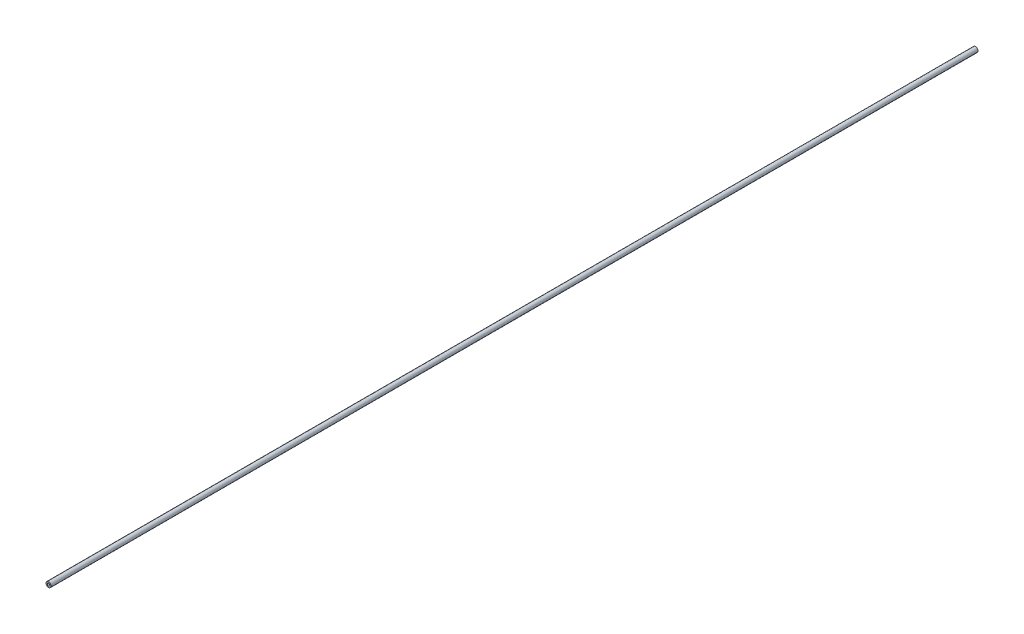
ISO-10303-21;
HEADER;
FILE_DESCRIPTION(('STEP AP214'),'2;1');
FILE_NAME('part.step','',(''),(''),'','','');
FILE_SCHEMA(('AUTOMOTIVE_DESIGN { 1 0 10303 214 1 1 1 1 }'));
ENDSEC;
DATA;
#1=APPLICATION_CONTEXT('core data for automotive mechanical design processes');
#2=APPLICATION_PROTOCOL_DEFINITION('international standard','automotive_design',2000,#1);
#3=PRODUCT_CONTEXT('',#1,'mechanical');
#4=PRODUCT('Part','Part','',(#3));
#5=PRODUCT_RELATED_PRODUCT_CATEGORY('part','',(#4));
#6=PRODUCT_DEFINITION_FORMATION('','',#4);
#7=PRODUCT_DEFINITION_CONTEXT('part definition',#1,'design');
#8=PRODUCT_DEFINITION('design','',#6,#7);
#9=PRODUCT_DEFINITION_SHAPE('','',#8);
#10=(LENGTH_UNIT() NAMED_UNIT(*) SI_UNIT(.MILLI.,.METRE.));
#11=(NAMED_UNIT(*) PLANE_ANGLE_UNIT() SI_UNIT($,.RADIAN.));
#12=(NAMED_UNIT(*) SI_UNIT($,.STERADIAN.) SOLID_ANGLE_UNIT());
#13=UNCERTAINTY_MEASURE_WITH_UNIT(LENGTH_MEASURE(1.E-05),#10,'distance_accuracy_value','');
#14=(GEOMETRIC_REPRESENTATION_CONTEXT(3) GLOBAL_UNCERTAINTY_ASSIGNED_CONTEXT((#13)) GLOBAL_UNIT_ASSIGNED_CONTEXT((#10,
#11,#12)) REPRESENTATION_CONTEXT('',''));
#15=CARTESIAN_POINT('',(0.,0.,0.));
#16=DIRECTION('',(0.,0.,1.));
#17=DIRECTION('',(1.,0.,0.));
#18=AXIS2_PLACEMENT_3D('',#15,#16,#17);
#19=CARTESIAN_POINT('',(0.,0.,0.));
#20=DIRECTION('',(0.,0.,1.));
#21=DIRECTION('',(1.,0.,0.));
#22=AXIS2_PLACEMENT_3D('',#19,#20,#21);
#23=CYLINDRICAL_SURFACE('',#22,1.5);
#24=CARTESIAN_POINT('',(0.,0.,0.));
#25=DIRECTION('',(0.,0.,-1.));
#26=DIRECTION('',(1.,0.,0.));
#27=AXIS2_PLACEMENT_3D('',#24,#25,#26);
#28=CIRCLE('',#27,1.5);
#29=CARTESIAN_POINT('',(-1.5,0.,0.));
#30=VERTEX_POINT('',#29);
#31=EDGE_CURVE('E63',#30,#30,#28,.T.);
#32=ORIENTED_EDGE('',*,*,#31,.T.);
#33=DIRECTION('',(0.,0.,1.));
#34=VECTOR('',#33,1.);
#35=CARTESIAN_POINT('',(-1.5,0.,0.));
#36=LINE('',#35,#34);
#37=CARTESIAN_POINT('',(-1.5,0.,1100.));
#38=VERTEX_POINT('',#37);
#39=EDGE_CURVE('E11',#30,#38,#36,.T.);
#40=ORIENTED_EDGE('',*,*,#39,.T.);
#41=CARTESIAN_POINT('',(0.,0.,1100.));
#42=DIRECTION('',(0.,0.,-1.));
#43=DIRECTION('',(1.,0.,0.));
#44=AXIS2_PLACEMENT_3D('',#41,#42,#43);
#45=CIRCLE('',#44,1.5);
#46=EDGE_CURVE('E27',#38,#38,#45,.T.);
#47=ORIENTED_EDGE('',*,*,#46,.F.);
#48=ORIENTED_EDGE('',*,*,#39,.F.);
#49=EDGE_LOOP('',(#32,#40,#47,#48));
#50=FACE_BOUND('',#49,.T.);
#51=ADVANCED_FACE('F17',(#50),#23,.F.);
#52=CARTESIAN_POINT('',(0.,0.,1100.));
#53=DIRECTION('',(0.,0.,1.));
#54=DIRECTION('',(1.,0.,0.));
#55=AXIS2_PLACEMENT_3D('',#52,#53,#54);
#56=PLANE('',#55);
#57=ORIENTED_EDGE('',*,*,#46,.T.);
#58=EDGE_LOOP('',(#57));
#59=FACE_BOUND('',#58,.T.);
#60=CARTESIAN_POINT('',(0.,0.,1100.));
#61=DIRECTION('',(0.,0.,1.));
#62=DIRECTION('',(1.,0.,0.));
#63=AXIS2_PLACEMENT_3D('',#60,#61,#62);
#64=CIRCLE('',#63,3.);
#65=CARTESIAN_POINT('',(-3.,0.,1100.));
#66=VERTEX_POINT('',#65);
#67=EDGE_CURVE('E55',#66,#66,#64,.T.);
#68=ORIENTED_EDGE('',*,*,#67,.T.);
#69=EDGE_LOOP('',(#68));
#70=FACE_BOUND('',#69,.T.);
#71=ADVANCED_FACE('F105',(#59,#70),#56,.T.);
#72=CARTESIAN_POINT('',(0.,0.,0.));
#73=DIRECTION('',(0.,0.,1.));
#74=DIRECTION('',(1.,0.,0.));
#75=AXIS2_PLACEMENT_3D('',#72,#73,#74);
#76=CYLINDRICAL_SURFACE('',#75,3.);
#77=ORIENTED_EDGE('',*,*,#67,.F.);
#78=DIRECTION('',(0.,0.,-1.));
#79=VECTOR('',#78,1.);
#80=CARTESIAN_POINT('',(-3.,0.,0.));
#81=LINE('',#80,#79);
#82=CARTESIAN_POINT('',(-3.,0.,0.));
#83=VERTEX_POINT('',#82);
#84=EDGE_CURVE('E20',#66,#83,#81,.T.);
#85=ORIENTED_EDGE('',*,*,#84,.T.);
#86=CARTESIAN_POINT('',(0.,0.,0.));
#87=DIRECTION('',(0.,0.,1.));
#88=DIRECTION('',(1.,0.,0.));
#89=AXIS2_PLACEMENT_3D('',#86,#87,#88);
#90=CIRCLE('',#89,3.);
#91=EDGE_CURVE('E53',#83,#83,#90,.T.);
#92=ORIENTED_EDGE('',*,*,#91,.T.);
#93=ORIENTED_EDGE('',*,*,#84,.F.);
#94=EDGE_LOOP('',(#77,#85,#92,#93));
#95=FACE_BOUND('',#94,.T.);
#96=ADVANCED_FACE('F51',(#95),#76,.T.);
#97=CARTESIAN_POINT('',(0.,0.,0.));
#98=DIRECTION('',(0.,0.,1.));
#99=DIRECTION('',(1.,0.,0.));
#100=AXIS2_PLACEMENT_3D('',#97,#98,#99);
#101=PLANE('',#100);
#102=ORIENTED_EDGE('',*,*,#31,.F.);
#103=EDGE_LOOP('',(#102));
#104=FACE_BOUND('',#103,.T.);
#105=ORIENTED_EDGE('',*,*,#91,.F.);
#106=EDGE_LOOP('',(#105));
#107=FACE_BOUND('',#106,.T.);
#108=ADVANCED_FACE('F88',(#104,#107),#101,.F.);
#109=CLOSED_SHELL('',(#51,#71,#96,#108));
#110=MANIFOLD_SOLID_BREP('B1',#109);
#111=ADVANCED_BREP_SHAPE_REPRESENTATION('',(#18,#110),#14);
#112=SHAPE_DEFINITION_REPRESENTATION(#9,#111);
ENDSEC;
END-ISO-10303-21;
